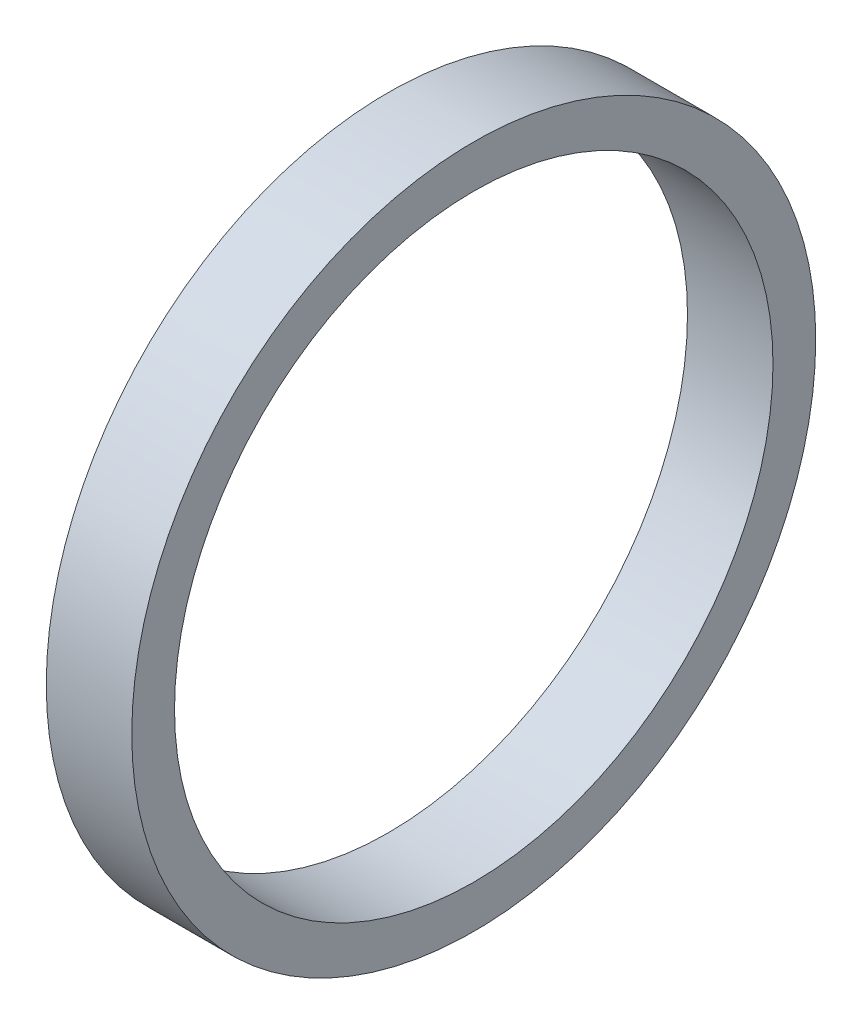
ISO-10303-21;
HEADER;
FILE_DESCRIPTION(('STEP AP214'),'2;1');
FILE_NAME('part.step','',(''),(''),'','','');
FILE_SCHEMA(('AUTOMOTIVE_DESIGN { 1 0 10303 214 1 1 1 1 }'));
ENDSEC;
DATA;
#1=APPLICATION_CONTEXT('core data for automotive mechanical design processes');
#2=APPLICATION_PROTOCOL_DEFINITION('international standard','automotive_design',2000,#1);
#3=PRODUCT_CONTEXT('',#1,'mechanical');
#4=PRODUCT('Part','Part','',(#3));
#5=PRODUCT_RELATED_PRODUCT_CATEGORY('part','',(#4));
#6=PRODUCT_DEFINITION_FORMATION('','',#4);
#7=PRODUCT_DEFINITION_CONTEXT('part definition',#1,'design');
#8=PRODUCT_DEFINITION('design','',#6,#7);
#9=PRODUCT_DEFINITION_SHAPE('','',#8);
#10=(LENGTH_UNIT() NAMED_UNIT(*) SI_UNIT(.MILLI.,.METRE.));
#11=(NAMED_UNIT(*) PLANE_ANGLE_UNIT() SI_UNIT($,.RADIAN.));
#12=(NAMED_UNIT(*) SI_UNIT($,.STERADIAN.) SOLID_ANGLE_UNIT());
#13=UNCERTAINTY_MEASURE_WITH_UNIT(LENGTH_MEASURE(1.E-05),#10,'distance_accuracy_value','');
#14=(GEOMETRIC_REPRESENTATION_CONTEXT(3) GLOBAL_UNCERTAINTY_ASSIGNED_CONTEXT((#13)) GLOBAL_UNIT_ASSIGNED_CONTEXT((#10,
#11,#12)) REPRESENTATION_CONTEXT('',''));
#15=CARTESIAN_POINT('',(0.,0.,0.));
#16=DIRECTION('',(0.,0.,1.));
#17=DIRECTION('',(1.,0.,0.));
#18=AXIS2_PLACEMENT_3D('',#15,#16,#17);
#19=CARTESIAN_POINT('',(0.,0.,0.));
#20=DIRECTION('',(-1.,0.,0.));
#21=DIRECTION('',(0.,0.,1.));
#22=AXIS2_PLACEMENT_3D('',#19,#20,#21);
#23=CYLINDRICAL_SURFACE('',#22,35.);
#24=CARTESIAN_POINT('',(10.,0.,0.));
#25=DIRECTION('',(-1.,0.,0.));
#26=DIRECTION('',(0.,0.,1.));
#27=AXIS2_PLACEMENT_3D('',#24,#25,#26);
#28=CIRCLE('',#27,35.);
#29=CARTESIAN_POINT('',(10.,0.,35.));
#30=VERTEX_POINT('',#29);
#31=EDGE_CURVE('E45',#30,#30,#28,.T.);
#32=ORIENTED_EDGE('',*,*,#31,.F.);
#33=EDGE_LOOP('',(#32));
#34=FACE_BOUND('',#33,.T.);
#35=CARTESIAN_POINT('',(0.,0.,0.));
#36=DIRECTION('',(-1.,0.,0.));
#37=DIRECTION('',(0.,0.,1.));
#38=AXIS2_PLACEMENT_3D('',#35,#36,#37);
#39=CIRCLE('',#38,35.);
#40=CARTESIAN_POINT('',(0.,0.,35.));
#41=VERTEX_POINT('',#40);
#42=EDGE_CURVE('E10',#41,#41,#39,.T.);
#43=ORIENTED_EDGE('',*,*,#42,.T.);
#44=EDGE_LOOP('',(#43));
#45=FACE_BOUND('',#44,.T.);
#46=ADVANCED_FACE('F31',(#34,#45),#23,.F.);
#47=CARTESIAN_POINT('',(0.,35.,0.));
#48=DIRECTION('',(1.,0.,0.));
#49=DIRECTION('',(0.,0.,-1.));
#50=AXIS2_PLACEMENT_3D('',#47,#48,#49);
#51=PLANE('',#50);
#52=ORIENTED_EDGE('',*,*,#42,.F.);
#53=EDGE_LOOP('',(#52));
#54=FACE_BOUND('',#53,.T.);
#55=CARTESIAN_POINT('',(0.,0.,0.));
#56=DIRECTION('',(-1.,0.,0.));
#57=DIRECTION('',(0.,0.,1.));
#58=AXIS2_PLACEMENT_3D('',#55,#56,#57);
#59=CIRCLE('',#58,40.);
#60=CARTESIAN_POINT('',(0.,0.,40.));
#61=VERTEX_POINT('',#60);
#62=EDGE_CURVE('E37',#61,#61,#59,.T.);
#63=ORIENTED_EDGE('',*,*,#62,.T.);
#64=EDGE_LOOP('',(#63));
#65=FACE_BOUND('',#64,.T.);
#66=ADVANCED_FACE('F54',(#54,#65),#51,.F.);
#67=CARTESIAN_POINT('',(0.,0.,0.));
#68=DIRECTION('',(-1.,0.,0.));
#69=DIRECTION('',(0.,0.,1.));
#70=AXIS2_PLACEMENT_3D('',#67,#68,#69);
#71=CYLINDRICAL_SURFACE('',#70,40.);
#72=ORIENTED_EDGE('',*,*,#62,.F.);
#73=EDGE_LOOP('',(#72));
#74=FACE_BOUND('',#73,.T.);
#75=CARTESIAN_POINT('',(10.,0.,0.));
#76=DIRECTION('',(-1.,0.,0.));
#77=DIRECTION('',(0.,0.,1.));
#78=AXIS2_PLACEMENT_3D('',#75,#76,#77);
#79=CIRCLE('',#78,40.);
#80=CARTESIAN_POINT('',(10.,0.,40.));
#81=VERTEX_POINT('',#80);
#82=EDGE_CURVE('E41',#81,#81,#79,.T.);
#83=ORIENTED_EDGE('',*,*,#82,.T.);
#84=EDGE_LOOP('',(#83));
#85=FACE_BOUND('',#84,.T.);
#86=ADVANCED_FACE('F58',(#74,#85),#71,.T.);
#87=CARTESIAN_POINT('',(10.,40.,0.));
#88=DIRECTION('',(-1.,0.,0.));
#89=DIRECTION('',(0.,0.,1.));
#90=AXIS2_PLACEMENT_3D('',#87,#88,#89);
#91=PLANE('',#90);
#92=ORIENTED_EDGE('',*,*,#82,.F.);
#93=EDGE_LOOP('',(#92));
#94=FACE_BOUND('',#93,.T.);
#95=ORIENTED_EDGE('',*,*,#31,.T.);
#96=EDGE_LOOP('',(#95));
#97=FACE_BOUND('',#96,.T.);
#98=ADVANCED_FACE('F51',(#94,#97),#91,.F.);
#99=CLOSED_SHELL('',(#46,#66,#86,#98));
#100=MANIFOLD_SOLID_BREP('B2',#99);
#101=ADVANCED_BREP_SHAPE_REPRESENTATION('',(#18,#100),#14);
#102=SHAPE_DEFINITION_REPRESENTATION(#9,#101);
ENDSEC;
END-ISO-10303-21;
